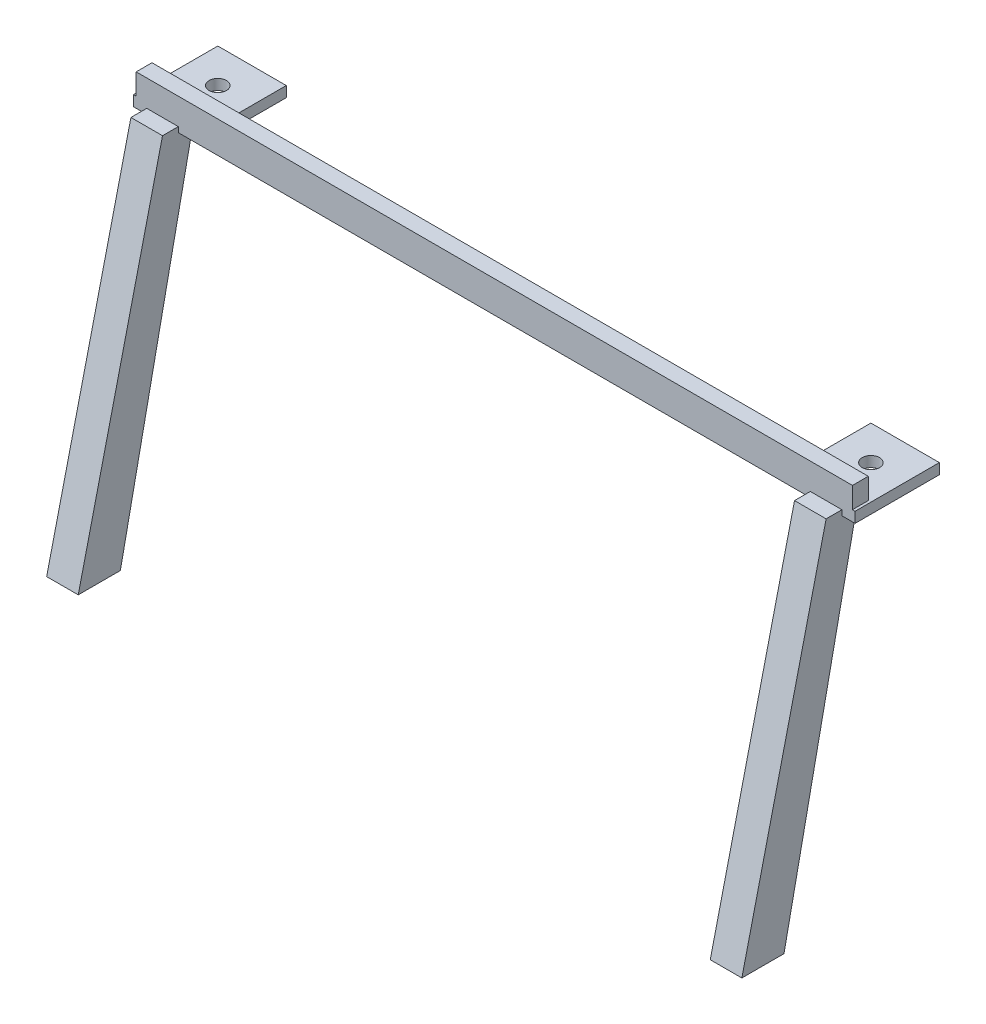
ISO-10303-21;
HEADER;
FILE_DESCRIPTION(('STEP AP214'),'2;1');
FILE_NAME('part.step','',(''),(''),'','','');
FILE_SCHEMA(('AUTOMOTIVE_DESIGN { 1 0 10303 214 1 1 1 1 }'));
ENDSEC;
DATA;
#1=APPLICATION_CONTEXT('core data for automotive mechanical design processes');
#2=APPLICATION_PROTOCOL_DEFINITION('international standard','automotive_design',2000,#1);
#3=PRODUCT_CONTEXT('',#1,'mechanical');
#4=PRODUCT('Part','Part','',(#3));
#5=PRODUCT_RELATED_PRODUCT_CATEGORY('part','',(#4));
#6=PRODUCT_DEFINITION_FORMATION('','',#4);
#7=PRODUCT_DEFINITION_CONTEXT('part definition',#1,'design');
#8=PRODUCT_DEFINITION('design','',#6,#7);
#9=PRODUCT_DEFINITION_SHAPE('','',#8);
#10=(LENGTH_UNIT() NAMED_UNIT(*) SI_UNIT(.MILLI.,.METRE.));
#11=(NAMED_UNIT(*) PLANE_ANGLE_UNIT() SI_UNIT($,.RADIAN.));
#12=(NAMED_UNIT(*) SI_UNIT($,.STERADIAN.) SOLID_ANGLE_UNIT());
#13=UNCERTAINTY_MEASURE_WITH_UNIT(LENGTH_MEASURE(1.E-05),#10,'distance_accuracy_value','');
#14=(GEOMETRIC_REPRESENTATION_CONTEXT(3) GLOBAL_UNCERTAINTY_ASSIGNED_CONTEXT((#13)) GLOBAL_UNIT_ASSIGNED_CONTEXT((#10,
#11,#12)) REPRESENTATION_CONTEXT('',''));
#15=CARTESIAN_POINT('',(0.,0.,0.));
#16=DIRECTION('',(0.,0.,1.));
#17=DIRECTION('',(1.,0.,0.));
#18=AXIS2_PLACEMENT_3D('',#15,#16,#17);
#19=CARTESIAN_POINT('',(0.,0.,0.));
#20=DIRECTION('',(0.,0.,1.));
#21=DIRECTION('',(1.,0.,0.));
#22=AXIS2_PLACEMENT_3D('',#19,#20,#21);
#23=PLANE('',#22);
#24=DIRECTION('',(0.,1.,0.));
#25=VECTOR('',#24,1.);
#26=CARTESIAN_POINT('',(55.5,0.,0.));
#27=LINE('',#26,#25);
#28=CARTESIAN_POINT('',(55.5,78.5,0.));
#29=VERTEX_POINT('',#28);
#30=CARTESIAN_POINT('',(55.5,80.5,0.));
#31=VERTEX_POINT('',#30);
#32=EDGE_CURVE('E304',#29,#31,#27,.T.);
#33=ORIENTED_EDGE('',*,*,#32,.F.);
#34=DIRECTION('',(1.,0.,0.));
#35=VECTOR('',#34,1.);
#36=CARTESIAN_POINT('',(-68.,78.5,0.));
#37=LINE('',#36,#35);
#38=CARTESIAN_POINT('',(-55.5,78.5,0.));
#39=VERTEX_POINT('',#38);
#40=EDGE_CURVE('E356',#39,#29,#37,.T.);
#41=ORIENTED_EDGE('',*,*,#40,.F.);
#42=DIRECTION('',(0.,-1.,0.));
#43=VECTOR('',#42,1.);
#44=CARTESIAN_POINT('',(-55.5,0.,0.));
#45=LINE('',#44,#43);
#46=CARTESIAN_POINT('',(-55.5,80.5,0.));
#47=VERTEX_POINT('',#46);
#48=EDGE_CURVE('E370',#47,#39,#45,.T.);
#49=ORIENTED_EDGE('',*,*,#48,.F.);
#50=DIRECTION('',(1.,0.,0.));
#51=VECTOR('',#50,1.);
#52=CARTESIAN_POINT('',(0.,80.5,0.));
#53=LINE('',#52,#51);
#54=CARTESIAN_POINT('',(-68.,80.5,0.));
#55=VERTEX_POINT('',#54);
#56=EDGE_CURVE('E367',#55,#47,#53,.T.);
#57=ORIENTED_EDGE('',*,*,#56,.F.);
#58=DIRECTION('',(0.,-1.,0.));
#59=VECTOR('',#58,1.);
#60=CARTESIAN_POINT('',(-68.,84.5,0.));
#61=LINE('',#60,#59);
#62=CARTESIAN_POINT('',(-68.,84.5,0.));
#63=VERTEX_POINT('',#62);
#64=EDGE_CURVE('E339',#63,#55,#61,.T.);
#65=ORIENTED_EDGE('',*,*,#64,.F.);
#66=DIRECTION('',(-1.,0.,0.));
#67=VECTOR('',#66,1.);
#68=CARTESIAN_POINT('',(68.,84.5,0.));
#69=LINE('',#68,#67);
#70=CARTESIAN_POINT('',(68.,84.5,0.));
#71=VERTEX_POINT('',#70);
#72=EDGE_CURVE('E344',#71,#63,#69,.T.);
#73=ORIENTED_EDGE('',*,*,#72,.F.);
#74=DIRECTION('',(0.,1.,0.));
#75=VECTOR('',#74,1.);
#76=CARTESIAN_POINT('',(68.,78.5,0.));
#77=LINE('',#76,#75);
#78=CARTESIAN_POINT('',(68.,80.5,0.));
#79=VERTEX_POINT('',#78);
#80=EDGE_CURVE('E359',#79,#71,#77,.T.);
#81=ORIENTED_EDGE('',*,*,#80,.F.);
#82=DIRECTION('',(1.,0.,0.));
#83=VECTOR('',#82,1.);
#84=CARTESIAN_POINT('',(0.,80.5,0.));
#85=LINE('',#84,#83);
#86=EDGE_CURVE('E302',#31,#79,#85,.T.);
#87=ORIENTED_EDGE('',*,*,#86,.F.);
#88=EDGE_LOOP('',(#33,#41,#49,#57,#65,#73,#81,#87));
#89=FACE_BOUND('',#88,.T.);
#90=ADVANCED_FACE('F39',(#89),#23,.F.);
#91=CARTESIAN_POINT('',(68.,78.5,3.));
#92=DIRECTION('',(-1.,0.,0.));
#93=DIRECTION('',(0.,0.,1.));
#94=AXIS2_PLACEMENT_3D('',#91,#92,#93);
#95=PLANE('',#94);
#96=DIRECTION('',(0.,0.,1.));
#97=VECTOR('',#96,1.);
#98=CARTESIAN_POINT('',(68.,80.5,3.));
#99=LINE('',#98,#97);
#100=CARTESIAN_POINT('',(68.,80.5,3.));
#101=VERTEX_POINT('',#100);
#102=EDGE_CURVE('E299',#79,#101,#99,.T.);
#103=ORIENTED_EDGE('',*,*,#102,.F.);
#104=ORIENTED_EDGE('',*,*,#80,.T.);
#105=DIRECTION('',(0.,0.,-1.));
#106=VECTOR('',#105,1.);
#107=CARTESIAN_POINT('',(68.,84.5,3.));
#108=LINE('',#107,#106);
#109=CARTESIAN_POINT('',(68.,84.5,3.));
#110=VERTEX_POINT('',#109);
#111=EDGE_CURVE('E364',#110,#71,#108,.T.);
#112=ORIENTED_EDGE('',*,*,#111,.F.);
#113=DIRECTION('',(0.,1.,0.));
#114=VECTOR('',#113,1.);
#115=CARTESIAN_POINT('',(68.,78.5,3.));
#116=LINE('',#115,#114);
#117=EDGE_CURVE('E348',#101,#110,#116,.T.);
#118=ORIENTED_EDGE('',*,*,#117,.F.);
#119=EDGE_LOOP('',(#103,#104,#112,#118));
#120=FACE_BOUND('',#119,.T.);
#121=ADVANCED_FACE('F420',(#120),#95,.F.);
#122=CARTESIAN_POINT('',(-68.,84.5,3.));
#123=DIRECTION('',(1.,0.,0.));
#124=DIRECTION('',(0.,0.,-1.));
#125=AXIS2_PLACEMENT_3D('',#122,#123,#124);
#126=PLANE('',#125);
#127=DIRECTION('',(0.,0.,-1.));
#128=VECTOR('',#127,1.);
#129=CARTESIAN_POINT('',(-68.,80.5,3.));
#130=LINE('',#129,#128);
#131=CARTESIAN_POINT('',(-68.,80.5,3.));
#132=VERTEX_POINT('',#131);
#133=EDGE_CURVE('E336',#132,#55,#130,.T.);
#134=ORIENTED_EDGE('',*,*,#133,.F.);
#135=DIRECTION('',(0.,-1.,0.));
#136=VECTOR('',#135,1.);
#137=CARTESIAN_POINT('',(-68.,84.5,3.));
#138=LINE('',#137,#136);
#139=CARTESIAN_POINT('',(-68.,84.5,3.));
#140=VERTEX_POINT('',#139);
#141=EDGE_CURVE('E340',#140,#132,#138,.T.);
#142=ORIENTED_EDGE('',*,*,#141,.F.);
#143=DIRECTION('',(0.,0.,-1.));
#144=VECTOR('',#143,1.);
#145=CARTESIAN_POINT('',(-68.,84.5,3.));
#146=LINE('',#145,#144);
#147=EDGE_CURVE('E353',#140,#63,#146,.T.);
#148=ORIENTED_EDGE('',*,*,#147,.T.);
#149=ORIENTED_EDGE('',*,*,#64,.T.);
#150=EDGE_LOOP('',(#134,#142,#148,#149));
#151=FACE_BOUND('',#150,.T.);
#152=ADVANCED_FACE('F41',(#151),#126,.F.);
#153=CARTESIAN_POINT('',(-68.,78.5,3.));
#154=DIRECTION('',(0.,1.,0.));
#155=DIRECTION('',(0.,0.,1.));
#156=AXIS2_PLACEMENT_3D('',#153,#154,#155);
#157=PLANE('',#156);
#158=CARTESIAN_POINT('',(62.,78.5,-6.5));
#159=DIRECTION('',(0.,1.,0.));
#160=DIRECTION('',(0.,0.,1.));
#161=AXIS2_PLACEMENT_3D('',#158,#159,#160);
#162=CIRCLE('',#161,1.65);
#163=CARTESIAN_POINT('',(62.,78.5,-4.85));
#164=VERTEX_POINT('',#163);
#165=EDGE_CURVE('E272',#164,#164,#162,.T.);
#166=ORIENTED_EDGE('',*,*,#165,.T.);
#167=EDGE_LOOP('',(#166));
#168=FACE_BOUND('',#167,.T.);
#169=DIRECTION('',(1.,0.,0.));
#170=VECTOR('',#169,1.);
#171=CARTESIAN_POINT('',(-68.,78.5,3.));
#172=LINE('',#171,#170);
#173=CARTESIAN_POINT('',(66.,78.5,3.));
#174=VERTEX_POINT('',#173);
#175=CARTESIAN_POINT('',(68.5,78.5,3.));
#176=VERTEX_POINT('',#175);
#177=EDGE_CURVE('E343',#174,#176,#172,.T.);
#178=ORIENTED_EDGE('',*,*,#177,.F.);
#179=DIRECTION('',(0.,0.,-1.));
#180=VECTOR('',#179,1.);
#181=CARTESIAN_POINT('',(66.,78.5,3.));
#182=LINE('',#181,#180);
#183=CARTESIAN_POINT('',(66.,78.5,0.207407407407406));
#184=VERTEX_POINT('',#183);
#185=EDGE_CURVE('E237',#174,#184,#182,.T.);
#186=ORIENTED_EDGE('',*,*,#185,.T.);
#187=DIRECTION('',(1.,0.,0.));
#188=VECTOR('',#187,1.);
#189=CARTESIAN_POINT('',(-68.,78.5,0.207407407407405));
#190=LINE('',#189,#188);
#191=CARTESIAN_POINT('',(60.,78.5,0.207407407407406));
#192=VERTEX_POINT('',#191);
#193=EDGE_CURVE('E11',#192,#184,#190,.T.);
#194=ORIENTED_EDGE('',*,*,#193,.F.);
#195=DIRECTION('',(0.,0.,-1.));
#196=VECTOR('',#195,1.);
#197=CARTESIAN_POINT('',(60.,78.5,3.));
#198=LINE('',#197,#196);
#199=CARTESIAN_POINT('',(60.,78.5,3.));
#200=VERTEX_POINT('',#199);
#201=EDGE_CURVE('E213',#200,#192,#198,.T.);
#202=ORIENTED_EDGE('',*,*,#201,.F.);
#203=CARTESIAN_POINT('',(-60.,78.5,3.));
#204=VERTEX_POINT('',#203);
#205=EDGE_CURVE('E349',#204,#200,#172,.T.);
#206=ORIENTED_EDGE('',*,*,#205,.F.);
#207=DIRECTION('',(0.,0.,-1.));
#208=VECTOR('',#207,1.);
#209=CARTESIAN_POINT('',(-60.,78.5,3.));
#210=LINE('',#209,#208);
#211=CARTESIAN_POINT('',(-60.,78.5,0.207407407407406));
#212=VERTEX_POINT('',#211);
#213=EDGE_CURVE('E268',#204,#212,#210,.T.);
#214=ORIENTED_EDGE('',*,*,#213,.T.);
#215=DIRECTION('',(1.,0.,0.));
#216=VECTOR('',#215,1.);
#217=CARTESIAN_POINT('',(-68.,78.5,0.207407407407405));
#218=LINE('',#217,#216);
#219=CARTESIAN_POINT('',(-66.,78.5,0.207407407407406));
#220=VERTEX_POINT('',#219);
#221=EDGE_CURVE('E385',#220,#212,#218,.T.);
#222=ORIENTED_EDGE('',*,*,#221,.F.);
#223=DIRECTION('',(0.,0.,-1.));
#224=VECTOR('',#223,1.);
#225=CARTESIAN_POINT('',(-66.,78.5,3.));
#226=LINE('',#225,#224);
#227=CARTESIAN_POINT('',(-66.,78.5,3.));
#228=VERTEX_POINT('',#227);
#229=EDGE_CURVE('E266',#228,#220,#226,.T.);
#230=ORIENTED_EDGE('',*,*,#229,.F.);
#231=CARTESIAN_POINT('',(-68.5,78.5,3.));
#232=VERTEX_POINT('',#231);
#233=EDGE_CURVE('E345',#232,#228,#172,.T.);
#234=ORIENTED_EDGE('',*,*,#233,.F.);
#235=DIRECTION('',(0.,0.,-1.));
#236=VECTOR('',#235,1.);
#237=CARTESIAN_POINT('',(-68.5,78.5,3.));
#238=LINE('',#237,#236);
#239=CARTESIAN_POINT('',(-68.5,78.5,-13.));
#240=VERTEX_POINT('',#239);
#241=EDGE_CURVE('E333',#232,#240,#238,.T.);
#242=ORIENTED_EDGE('',*,*,#241,.T.);
#243=DIRECTION('',(1.,0.,0.));
#244=VECTOR('',#243,1.);
#245=CARTESIAN_POINT('',(-68.5,78.5,-13.));
#246=LINE('',#245,#244);
#247=CARTESIAN_POINT('',(-55.5,78.5,-13.));
#248=VERTEX_POINT('',#247);
#249=EDGE_CURVE('E320',#240,#248,#246,.T.);
#250=ORIENTED_EDGE('',*,*,#249,.T.);
#251=DIRECTION('',(0.,0.,-1.));
#252=VECTOR('',#251,1.);
#253=CARTESIAN_POINT('',(-55.5,78.5,3.));
#254=LINE('',#253,#252);
#255=EDGE_CURVE('E331',#39,#248,#254,.T.);
#256=ORIENTED_EDGE('',*,*,#255,.F.);
#257=ORIENTED_EDGE('',*,*,#40,.T.);
#258=DIRECTION('',(0.,0.,-1.));
#259=VECTOR('',#258,1.);
#260=CARTESIAN_POINT('',(55.5,78.5,3.));
#261=LINE('',#260,#259);
#262=CARTESIAN_POINT('',(55.5,78.5,-13.));
#263=VERTEX_POINT('',#262);
#264=EDGE_CURVE('E297',#29,#263,#261,.T.);
#265=ORIENTED_EDGE('',*,*,#264,.T.);
#266=DIRECTION('',(1.,0.,0.));
#267=VECTOR('',#266,1.);
#268=CARTESIAN_POINT('',(55.5,78.5,-13.));
#269=LINE('',#268,#267);
#270=CARTESIAN_POINT('',(68.5,78.5,-13.));
#271=VERTEX_POINT('',#270);
#272=EDGE_CURVE('E284',#263,#271,#269,.T.);
#273=ORIENTED_EDGE('',*,*,#272,.T.);
#274=DIRECTION('',(0.,0.,-1.));
#275=VECTOR('',#274,1.);
#276=CARTESIAN_POINT('',(68.5,78.5,3.));
#277=LINE('',#276,#275);
#278=EDGE_CURVE('E294',#176,#271,#277,.T.);
#279=ORIENTED_EDGE('',*,*,#278,.F.);
#280=EDGE_LOOP('',(#178,#186,#194,#202,#206,#214,#222,#230,#234,#242,#250,#256,#257,#265,#273,#279));
#281=FACE_BOUND('',#280,.T.);
#282=CARTESIAN_POINT('',(-62.,78.5,-6.5));
#283=DIRECTION('',(0.,1.,0.));
#284=DIRECTION('',(0.,0.,1.));
#285=AXIS2_PLACEMENT_3D('',#282,#283,#284);
#286=CIRCLE('',#285,1.65);
#287=CARTESIAN_POINT('',(-62.,78.5,-4.85));
#288=VERTEX_POINT('',#287);
#289=EDGE_CURVE('E307',#288,#288,#286,.T.);
#290=ORIENTED_EDGE('',*,*,#289,.T.);
#291=EDGE_LOOP('',(#290));
#292=FACE_BOUND('',#291,.T.);
#293=ADVANCED_FACE('F402',(#168,#281,#292),#157,.F.);
#294=CARTESIAN_POINT('',(68.,84.5,3.));
#295=DIRECTION('',(0.,-1.,0.));
#296=DIRECTION('',(0.,0.,-1.));
#297=AXIS2_PLACEMENT_3D('',#294,#295,#296);
#298=PLANE('',#297);
#299=ORIENTED_EDGE('',*,*,#72,.T.);
#300=ORIENTED_EDGE('',*,*,#147,.F.);
#301=DIRECTION('',(-1.,0.,0.));
#302=VECTOR('',#301,1.);
#303=CARTESIAN_POINT('',(68.,84.5,3.));
#304=LINE('',#303,#302);
#305=EDGE_CURVE('E351',#110,#140,#304,.T.);
#306=ORIENTED_EDGE('',*,*,#305,.F.);
#307=ORIENTED_EDGE('',*,*,#111,.T.);
#308=EDGE_LOOP('',(#299,#300,#306,#307));
#309=FACE_BOUND('',#308,.T.);
#310=ADVANCED_FACE('F432',(#309),#298,.F.);
#311=CARTESIAN_POINT('',(0.,0.,3.));
#312=DIRECTION('',(0.,0.,1.));
#313=DIRECTION('',(1.,0.,0.));
#314=AXIS2_PLACEMENT_3D('',#311,#312,#313);
#315=PLANE('',#314);
#316=DIRECTION('',(0.,1.,0.));
#317=VECTOR('',#316,1.);
#318=CARTESIAN_POINT('',(66.,0.,3.));
#319=LINE('',#318,#317);
#320=CARTESIAN_POINT('',(66.,79.5,3.));
#321=VERTEX_POINT('',#320);
#322=EDGE_CURVE('E47',#174,#321,#319,.T.);
#323=ORIENTED_EDGE('',*,*,#322,.F.);
#324=ORIENTED_EDGE('',*,*,#177,.T.);
#325=DIRECTION('',(0.,1.,0.));
#326=VECTOR('',#325,1.);
#327=CARTESIAN_POINT('',(68.5,78.5,3.));
#328=LINE('',#327,#326);
#329=CARTESIAN_POINT('',(68.5,80.5,3.));
#330=VERTEX_POINT('',#329);
#331=EDGE_CURVE('E276',#176,#330,#328,.T.);
#332=ORIENTED_EDGE('',*,*,#331,.T.);
#333=DIRECTION('',(-1.,0.,0.));
#334=VECTOR('',#333,1.);
#335=CARTESIAN_POINT('',(68.5,80.5,3.));
#336=LINE('',#335,#334);
#337=EDGE_CURVE('E278',#330,#101,#336,.T.);
#338=ORIENTED_EDGE('',*,*,#337,.T.);
#339=ORIENTED_EDGE('',*,*,#117,.T.);
#340=ORIENTED_EDGE('',*,*,#305,.T.);
#341=ORIENTED_EDGE('',*,*,#141,.T.);
#342=DIRECTION('',(-1.,0.,0.));
#343=VECTOR('',#342,1.);
#344=CARTESIAN_POINT('',(-55.5,80.5,3.));
#345=LINE('',#344,#343);
#346=CARTESIAN_POINT('',(-68.5,80.5,3.));
#347=VERTEX_POINT('',#346);
#348=EDGE_CURVE('E314',#132,#347,#345,.T.);
#349=ORIENTED_EDGE('',*,*,#348,.T.);
#350=DIRECTION('',(0.,-1.,0.));
#351=VECTOR('',#350,1.);
#352=CARTESIAN_POINT('',(-68.5,80.5,3.));
#353=LINE('',#352,#351);
#354=EDGE_CURVE('E311',#347,#232,#353,.T.);
#355=ORIENTED_EDGE('',*,*,#354,.T.);
#356=ORIENTED_EDGE('',*,*,#233,.T.);
#357=DIRECTION('',(0.,1.,0.));
#358=VECTOR('',#357,1.);
#359=CARTESIAN_POINT('',(-66.,0.,3.));
#360=LINE('',#359,#358);
#361=CARTESIAN_POINT('',(-66.,79.5,3.));
#362=VERTEX_POINT('',#361);
#363=EDGE_CURVE('E373',#228,#362,#360,.T.);
#364=ORIENTED_EDGE('',*,*,#363,.T.);
#365=DIRECTION('',(1.,0.,0.));
#366=VECTOR('',#365,1.);
#367=CARTESIAN_POINT('',(0.,79.5,3.));
#368=LINE('',#367,#366);
#369=CARTESIAN_POINT('',(-60.,79.5,3.));
#370=VERTEX_POINT('',#369);
#371=EDGE_CURVE('E380',#362,#370,#368,.T.);
#372=ORIENTED_EDGE('',*,*,#371,.T.);
#373=DIRECTION('',(0.,1.,0.));
#374=VECTOR('',#373,1.);
#375=CARTESIAN_POINT('',(-60.,0.,3.));
#376=LINE('',#375,#374);
#377=EDGE_CURVE('E383',#204,#370,#376,.T.);
#378=ORIENTED_EDGE('',*,*,#377,.F.);
#379=ORIENTED_EDGE('',*,*,#205,.T.);
#380=DIRECTION('',(0.,1.,0.));
#381=VECTOR('',#380,1.);
#382=CARTESIAN_POINT('',(60.,0.,3.));
#383=LINE('',#382,#381);
#384=CARTESIAN_POINT('',(60.,79.5,3.));
#385=VERTEX_POINT('',#384);
#386=EDGE_CURVE('E387',#200,#385,#383,.T.);
#387=ORIENTED_EDGE('',*,*,#386,.T.);
#388=DIRECTION('',(1.,0.,0.));
#389=VECTOR('',#388,1.);
#390=CARTESIAN_POINT('',(0.,79.5,3.));
#391=LINE('',#390,#389);
#392=EDGE_CURVE('E390',#385,#321,#391,.T.);
#393=ORIENTED_EDGE('',*,*,#392,.T.);
#394=EDGE_LOOP('',(#323,#324,#332,#338,#339,#340,#341,#349,#355,#356,#364,#372,#378,#379,#387,#393));
#395=FACE_BOUND('',#394,.T.);
#396=ADVANCED_FACE('F392',(#395),#315,.T.);
#397=CARTESIAN_POINT('',(-55.5,78.5,3.));
#398=DIRECTION('',(-1.,0.,0.));
#399=DIRECTION('',(0.,0.,1.));
#400=AXIS2_PLACEMENT_3D('',#397,#398,#399);
#401=PLANE('',#400);
#402=DIRECTION('',(0.,0.,-1.));
#403=VECTOR('',#402,1.);
#404=CARTESIAN_POINT('',(-55.5,80.5,3.));
#405=LINE('',#404,#403);
#406=CARTESIAN_POINT('',(-55.5,80.5,-13.));
#407=VERTEX_POINT('',#406);
#408=EDGE_CURVE('E329',#47,#407,#405,.T.);
#409=ORIENTED_EDGE('',*,*,#408,.F.);
#410=ORIENTED_EDGE('',*,*,#48,.T.);
#411=ORIENTED_EDGE('',*,*,#255,.T.);
#412=DIRECTION('',(0.,1.,0.));
#413=VECTOR('',#412,1.);
#414=CARTESIAN_POINT('',(-55.5,78.5,-13.));
#415=LINE('',#414,#413);
#416=EDGE_CURVE('E323',#248,#407,#415,.T.);
#417=ORIENTED_EDGE('',*,*,#416,.T.);
#418=EDGE_LOOP('',(#409,#410,#411,#417));
#419=FACE_BOUND('',#418,.T.);
#420=ADVANCED_FACE('F485',(#419),#401,.F.);
#421=CARTESIAN_POINT('',(-55.5,80.5,3.));
#422=DIRECTION('',(0.,-1.,0.));
#423=DIRECTION('',(0.,0.,-1.));
#424=AXIS2_PLACEMENT_3D('',#421,#422,#423);
#425=PLANE('',#424);
#426=CARTESIAN_POINT('',(-62.,80.5,-6.5));
#427=DIRECTION('',(0.,-1.,0.));
#428=DIRECTION('',(0.,0.,-1.));
#429=AXIS2_PLACEMENT_3D('',#426,#427,#428);
#430=CIRCLE('',#429,1.65);
#431=CARTESIAN_POINT('',(-62.,80.5,-8.15));
#432=VERTEX_POINT('',#431);
#433=EDGE_CURVE('E306',#432,#432,#430,.T.);
#434=ORIENTED_EDGE('',*,*,#433,.T.);
#435=EDGE_LOOP('',(#434));
#436=FACE_BOUND('',#435,.T.);
#437=ORIENTED_EDGE('',*,*,#348,.F.);
#438=ORIENTED_EDGE('',*,*,#133,.T.);
#439=ORIENTED_EDGE('',*,*,#56,.T.);
#440=ORIENTED_EDGE('',*,*,#408,.T.);
#441=DIRECTION('',(-1.,0.,0.));
#442=VECTOR('',#441,1.);
#443=CARTESIAN_POINT('',(-55.5,80.5,-13.));
#444=LINE('',#443,#442);
#445=CARTESIAN_POINT('',(-68.5,80.5,-13.));
#446=VERTEX_POINT('',#445);
#447=EDGE_CURVE('E315',#407,#446,#444,.T.);
#448=ORIENTED_EDGE('',*,*,#447,.T.);
#449=DIRECTION('',(0.,0.,-1.));
#450=VECTOR('',#449,1.);
#451=CARTESIAN_POINT('',(-68.5,80.5,3.));
#452=LINE('',#451,#450);
#453=EDGE_CURVE('E317',#347,#446,#452,.T.);
#454=ORIENTED_EDGE('',*,*,#453,.F.);
#455=EDGE_LOOP('',(#437,#438,#439,#440,#448,#454));
#456=FACE_BOUND('',#455,.T.);
#457=ADVANCED_FACE('F482',(#436,#456),#425,.F.);
#458=CARTESIAN_POINT('',(-68.5,80.5,3.));
#459=DIRECTION('',(1.,0.,0.));
#460=DIRECTION('',(0.,0.,-1.));
#461=AXIS2_PLACEMENT_3D('',#458,#459,#460);
#462=PLANE('',#461);
#463=DIRECTION('',(0.,-1.,0.));
#464=VECTOR('',#463,1.);
#465=CARTESIAN_POINT('',(-68.5,80.5,-13.));
#466=LINE('',#465,#464);
#467=EDGE_CURVE('E310',#446,#240,#466,.T.);
#468=ORIENTED_EDGE('',*,*,#467,.T.);
#469=ORIENTED_EDGE('',*,*,#241,.F.);
#470=ORIENTED_EDGE('',*,*,#354,.F.);
#471=ORIENTED_EDGE('',*,*,#453,.T.);
#472=EDGE_LOOP('',(#468,#469,#470,#471));
#473=FACE_BOUND('',#472,.T.);
#474=ADVANCED_FACE('F480',(#473),#462,.F.);
#475=CARTESIAN_POINT('',(0.,0.,-13.));
#476=DIRECTION('',(0.,0.,1.));
#477=DIRECTION('',(1.,0.,0.));
#478=AXIS2_PLACEMENT_3D('',#475,#476,#477);
#479=PLANE('',#478);
#480=ORIENTED_EDGE('',*,*,#467,.F.);
#481=ORIENTED_EDGE('',*,*,#447,.F.);
#482=ORIENTED_EDGE('',*,*,#416,.F.);
#483=ORIENTED_EDGE('',*,*,#249,.F.);
#484=EDGE_LOOP('',(#480,#481,#482,#483));
#485=FACE_BOUND('',#484,.T.);
#486=ADVANCED_FACE('F476',(#485),#479,.F.);
#487=CARTESIAN_POINT('',(-62.,-100.,-6.5));
#488=DIRECTION('',(0.,1.,0.));
#489=DIRECTION('',(0.,0.,1.));
#490=AXIS2_PLACEMENT_3D('',#487,#488,#489);
#491=CYLINDRICAL_SURFACE('',#490,1.65);
#492=ORIENTED_EDGE('',*,*,#433,.F.);
#493=EDGE_LOOP('',(#492));
#494=FACE_BOUND('',#493,.T.);
#495=ORIENTED_EDGE('',*,*,#289,.F.);
#496=EDGE_LOOP('',(#495));
#497=FACE_BOUND('',#496,.T.);
#498=ADVANCED_FACE('F472',(#494,#497),#491,.F.);
#499=CARTESIAN_POINT('',(55.5,80.5,3.));
#500=DIRECTION('',(1.,0.,0.));
#501=DIRECTION('',(0.,0.,-1.));
#502=AXIS2_PLACEMENT_3D('',#499,#500,#501);
#503=PLANE('',#502);
#504=ORIENTED_EDGE('',*,*,#264,.F.);
#505=ORIENTED_EDGE('',*,*,#32,.T.);
#506=DIRECTION('',(0.,0.,-1.));
#507=VECTOR('',#506,1.);
#508=CARTESIAN_POINT('',(55.5,80.5,3.));
#509=LINE('',#508,#507);
#510=CARTESIAN_POINT('',(55.5,80.5,-13.));
#511=VERTEX_POINT('',#510);
#512=EDGE_CURVE('E281',#31,#511,#509,.T.);
#513=ORIENTED_EDGE('',*,*,#512,.T.);
#514=DIRECTION('',(0.,-1.,0.));
#515=VECTOR('',#514,1.);
#516=CARTESIAN_POINT('',(55.5,80.5,-13.));
#517=LINE('',#516,#515);
#518=EDGE_CURVE('E275',#511,#263,#517,.T.);
#519=ORIENTED_EDGE('',*,*,#518,.T.);
#520=EDGE_LOOP('',(#504,#505,#513,#519));
#521=FACE_BOUND('',#520,.T.);
#522=ADVANCED_FACE('F465',(#521),#503,.F.);
#523=CARTESIAN_POINT('',(68.5,80.5,3.));
#524=DIRECTION('',(0.,-1.,0.));
#525=DIRECTION('',(0.,0.,-1.));
#526=AXIS2_PLACEMENT_3D('',#523,#524,#525);
#527=PLANE('',#526);
#528=CARTESIAN_POINT('',(62.,80.5,-6.5));
#529=DIRECTION('',(0.,-1.,0.));
#530=DIRECTION('',(0.,0.,-1.));
#531=AXIS2_PLACEMENT_3D('',#528,#529,#530);
#532=CIRCLE('',#531,1.65);
#533=CARTESIAN_POINT('',(62.,80.5,-8.15));
#534=VERTEX_POINT('',#533);
#535=EDGE_CURVE('E271',#534,#534,#532,.T.);
#536=ORIENTED_EDGE('',*,*,#535,.T.);
#537=EDGE_LOOP('',(#536));
#538=FACE_BOUND('',#537,.T.);
#539=ORIENTED_EDGE('',*,*,#512,.F.);
#540=ORIENTED_EDGE('',*,*,#86,.T.);
#541=ORIENTED_EDGE('',*,*,#102,.T.);
#542=ORIENTED_EDGE('',*,*,#337,.F.);
#543=DIRECTION('',(0.,0.,-1.));
#544=VECTOR('',#543,1.);
#545=CARTESIAN_POINT('',(68.5,80.5,3.));
#546=LINE('',#545,#544);
#547=CARTESIAN_POINT('',(68.5,80.5,-13.));
#548=VERTEX_POINT('',#547);
#549=EDGE_CURVE('E291',#330,#548,#546,.T.);
#550=ORIENTED_EDGE('',*,*,#549,.T.);
#551=DIRECTION('',(-1.,0.,0.));
#552=VECTOR('',#551,1.);
#553=CARTESIAN_POINT('',(68.5,80.5,-13.));
#554=LINE('',#553,#552);
#555=EDGE_CURVE('E279',#548,#511,#554,.T.);
#556=ORIENTED_EDGE('',*,*,#555,.T.);
#557=EDGE_LOOP('',(#539,#540,#541,#542,#550,#556));
#558=FACE_BOUND('',#557,.T.);
#559=ADVANCED_FACE('F462',(#538,#558),#527,.F.);
#560=CARTESIAN_POINT('',(68.5,78.5,3.));
#561=DIRECTION('',(-1.,0.,0.));
#562=DIRECTION('',(0.,0.,1.));
#563=AXIS2_PLACEMENT_3D('',#560,#561,#562);
#564=PLANE('',#563);
#565=DIRECTION('',(0.,1.,0.));
#566=VECTOR('',#565,1.);
#567=CARTESIAN_POINT('',(68.5,78.5,-13.));
#568=LINE('',#567,#566);
#569=EDGE_CURVE('E286',#271,#548,#568,.T.);
#570=ORIENTED_EDGE('',*,*,#569,.T.);
#571=ORIENTED_EDGE('',*,*,#549,.F.);
#572=ORIENTED_EDGE('',*,*,#331,.F.);
#573=ORIENTED_EDGE('',*,*,#278,.T.);
#574=EDGE_LOOP('',(#570,#571,#572,#573));
#575=FACE_BOUND('',#574,.T.);
#576=ADVANCED_FACE('F456',(#575),#564,.F.);
#577=CARTESIAN_POINT('',(0.,0.,-13.));
#578=DIRECTION('',(0.,0.,1.));
#579=DIRECTION('',(1.,0.,0.));
#580=AXIS2_PLACEMENT_3D('',#577,#578,#579);
#581=PLANE('',#580);
#582=ORIENTED_EDGE('',*,*,#518,.F.);
#583=ORIENTED_EDGE('',*,*,#555,.F.);
#584=ORIENTED_EDGE('',*,*,#569,.F.);
#585=ORIENTED_EDGE('',*,*,#272,.F.);
#586=EDGE_LOOP('',(#582,#583,#584,#585));
#587=FACE_BOUND('',#586,.T.);
#588=ADVANCED_FACE('F446',(#587),#581,.F.);
#589=CARTESIAN_POINT('',(62.,-100.,-6.5));
#590=DIRECTION('',(0.,1.,0.));
#591=DIRECTION('',(0.,0.,1.));
#592=AXIS2_PLACEMENT_3D('',#589,#590,#591);
#593=CYLINDRICAL_SURFACE('',#592,1.65);
#594=ORIENTED_EDGE('',*,*,#535,.F.);
#595=EDGE_LOOP('',(#594));
#596=FACE_BOUND('',#595,.T.);
#597=ORIENTED_EDGE('',*,*,#165,.F.);
#598=EDGE_LOOP('',(#597));
#599=FACE_BOUND('',#598,.T.);
#600=ADVANCED_FACE('F443',(#596,#599),#593,.F.);
#601=CARTESIAN_POINT('',(-60.,12.,14.));
#602=DIRECTION('',(0.,0.203085256585688,0.979161058538137));
#603=DIRECTION('',(0.,-0.979161058538137,0.203085256585688));
#604=AXIS2_PLACEMENT_3D('',#601,#602,#603);
#605=PLANE('',#604);
#606=DIRECTION('',(0.,0.979161058538137,-0.203085256585688));
#607=VECTOR('',#606,1.);
#608=CARTESIAN_POINT('',(-66.,12.,14.));
#609=LINE('',#608,#607);
#610=CARTESIAN_POINT('',(-66.,12.,14.));
#611=VERTEX_POINT('',#610);
#612=EDGE_CURVE('E240',#611,#220,#609,.T.);
#613=ORIENTED_EDGE('',*,*,#612,.T.);
#614=ORIENTED_EDGE('',*,*,#221,.T.);
#615=DIRECTION('',(0.,0.979161058538137,-0.203085256585688));
#616=VECTOR('',#615,1.);
#617=CARTESIAN_POINT('',(-60.,12.,14.));
#618=LINE('',#617,#616);
#619=CARTESIAN_POINT('',(-60.,12.,14.));
#620=VERTEX_POINT('',#619);
#621=EDGE_CURVE('E241',#620,#212,#618,.T.);
#622=ORIENTED_EDGE('',*,*,#621,.F.);
#623=DIRECTION('',(-1.,0.,0.));
#624=VECTOR('',#623,1.);
#625=CARTESIAN_POINT('',(-60.,12.,14.));
#626=LINE('',#625,#624);
#627=EDGE_CURVE('E251',#620,#611,#626,.T.);
#628=ORIENTED_EDGE('',*,*,#627,.T.);
#629=EDGE_LOOP('',(#613,#614,#622,#628));
#630=FACE_BOUND('',#629,.T.);
#631=ADVANCED_FACE('F445',(#630),#605,.F.);
#632=CARTESIAN_POINT('',(-60.,0.,0.));
#633=DIRECTION('',(1.,0.,0.));
#634=DIRECTION('',(0.,0.,-1.));
#635=AXIS2_PLACEMENT_3D('',#632,#633,#634);
#636=PLANE('',#635);
#637=ORIENTED_EDGE('',*,*,#213,.F.);
#638=ORIENTED_EDGE('',*,*,#377,.T.);
#639=DIRECTION('',(0.,0.,1.));
#640=VECTOR('',#639,1.);
#641=CARTESIAN_POINT('',(-60.,79.5,0.));
#642=LINE('',#641,#640);
#643=CARTESIAN_POINT('',(-60.,79.5,6.));
#644=VERTEX_POINT('',#643);
#645=EDGE_CURVE('E244',#370,#644,#642,.T.);
#646=ORIENTED_EDGE('',*,*,#645,.T.);
#647=DIRECTION('',(0.,-0.973037733746812,0.230645981332578));
#648=VECTOR('',#647,1.);
#649=CARTESIAN_POINT('',(-60.,79.5,6.));
#650=LINE('',#649,#648);
#651=CARTESIAN_POINT('',(-60.,12.,22.));
#652=VERTEX_POINT('',#651);
#653=EDGE_CURVE('E247',#644,#652,#650,.T.);
#654=ORIENTED_EDGE('',*,*,#653,.T.);
#655=DIRECTION('',(0.,0.,-1.));
#656=VECTOR('',#655,1.);
#657=CARTESIAN_POINT('',(-60.,12.,22.));
#658=LINE('',#657,#656);
#659=EDGE_CURVE('E249',#652,#620,#658,.T.);
#660=ORIENTED_EDGE('',*,*,#659,.T.);
#661=ORIENTED_EDGE('',*,*,#621,.T.);
#662=EDGE_LOOP('',(#637,#638,#646,#654,#660,#661));
#663=FACE_BOUND('',#662,.T.);
#664=ADVANCED_FACE('F453',(#663),#636,.T.);
#665=CARTESIAN_POINT('',(-66.,0.,0.));
#666=DIRECTION('',(1.,0.,0.));
#667=DIRECTION('',(0.,0.,-1.));
#668=AXIS2_PLACEMENT_3D('',#665,#666,#667);
#669=PLANE('',#668);
#670=ORIENTED_EDGE('',*,*,#363,.F.);
#671=ORIENTED_EDGE('',*,*,#229,.T.);
#672=ORIENTED_EDGE('',*,*,#612,.F.);
#673=DIRECTION('',(0.,0.,-1.));
#674=VECTOR('',#673,1.);
#675=CARTESIAN_POINT('',(-66.,12.,22.));
#676=LINE('',#675,#674);
#677=CARTESIAN_POINT('',(-66.,12.,22.));
#678=VERTEX_POINT('',#677);
#679=EDGE_CURVE('E245',#678,#611,#676,.T.);
#680=ORIENTED_EDGE('',*,*,#679,.F.);
#681=DIRECTION('',(0.,-0.973037733746812,0.230645981332578));
#682=VECTOR('',#681,1.);
#683=CARTESIAN_POINT('',(-66.,79.5,6.));
#684=LINE('',#683,#682);
#685=CARTESIAN_POINT('',(-66.,79.5,6.));
#686=VERTEX_POINT('',#685);
#687=EDGE_CURVE('E255',#686,#678,#684,.T.);
#688=ORIENTED_EDGE('',*,*,#687,.F.);
#689=DIRECTION('',(0.,0.,1.));
#690=VECTOR('',#689,1.);
#691=CARTESIAN_POINT('',(-66.,79.5,0.));
#692=LINE('',#691,#690);
#693=EDGE_CURVE('E62',#362,#686,#692,.T.);
#694=ORIENTED_EDGE('',*,*,#693,.F.);
#695=EDGE_LOOP('',(#670,#671,#672,#680,#688,#694));
#696=FACE_BOUND('',#695,.T.);
#697=ADVANCED_FACE('F525',(#696),#669,.F.);
#698=CARTESIAN_POINT('',(-60.,79.5,0.));
#699=DIRECTION('',(0.,-1.,0.));
#700=DIRECTION('',(0.,0.,-1.));
#701=AXIS2_PLACEMENT_3D('',#698,#699,#700);
#702=PLANE('',#701);
#703=ORIENTED_EDGE('',*,*,#371,.F.);
#704=ORIENTED_EDGE('',*,*,#693,.T.);
#705=DIRECTION('',(-1.,0.,0.));
#706=VECTOR('',#705,1.);
#707=CARTESIAN_POINT('',(-60.,79.5,6.));
#708=LINE('',#707,#706);
#709=EDGE_CURVE('E263',#644,#686,#708,.T.);
#710=ORIENTED_EDGE('',*,*,#709,.F.);
#711=ORIENTED_EDGE('',*,*,#645,.F.);
#712=EDGE_LOOP('',(#703,#704,#710,#711));
#713=FACE_BOUND('',#712,.T.);
#714=ADVANCED_FACE('F541',(#713),#702,.F.);
#715=CARTESIAN_POINT('',(-60.,79.5,6.));
#716=DIRECTION('',(0.,-0.230645981332578,-0.973037733746812));
#717=DIRECTION('',(0.,0.973037733746812,-0.230645981332578));
#718=AXIS2_PLACEMENT_3D('',#715,#716,#717);
#719=PLANE('',#718);
#720=ORIENTED_EDGE('',*,*,#687,.T.);
#721=DIRECTION('',(-1.,0.,0.));
#722=VECTOR('',#721,1.);
#723=CARTESIAN_POINT('',(-60.,12.,22.));
#724=LINE('',#723,#722);
#725=EDGE_CURVE('E260',#652,#678,#724,.T.);
#726=ORIENTED_EDGE('',*,*,#725,.F.);
#727=ORIENTED_EDGE('',*,*,#653,.F.);
#728=ORIENTED_EDGE('',*,*,#709,.T.);
#729=EDGE_LOOP('',(#720,#726,#727,#728));
#730=FACE_BOUND('',#729,.T.);
#731=ADVANCED_FACE('F538',(#730),#719,.F.);
#732=CARTESIAN_POINT('',(-60.,12.,22.));
#733=DIRECTION('',(0.,1.,0.));
#734=DIRECTION('',(0.,0.,1.));
#735=AXIS2_PLACEMENT_3D('',#732,#733,#734);
#736=PLANE('',#735);
#737=ORIENTED_EDGE('',*,*,#679,.T.);
#738=ORIENTED_EDGE('',*,*,#627,.F.);
#739=ORIENTED_EDGE('',*,*,#659,.F.);
#740=ORIENTED_EDGE('',*,*,#725,.T.);
#741=EDGE_LOOP('',(#737,#738,#739,#740));
#742=FACE_BOUND('',#741,.T.);
#743=ADVANCED_FACE('F536',(#742),#736,.F.);
#744=CARTESIAN_POINT('',(66.,12.,14.));
#745=DIRECTION('',(0.,0.203085256585688,0.979161058538137));
#746=DIRECTION('',(0.,-0.979161058538137,0.203085256585688));
#747=AXIS2_PLACEMENT_3D('',#744,#745,#746);
#748=PLANE('',#747);
#749=DIRECTION('',(0.,0.979161058538137,-0.203085256585688));
#750=VECTOR('',#749,1.);
#751=CARTESIAN_POINT('',(60.,12.,14.));
#752=LINE('',#751,#750);
#753=CARTESIAN_POINT('',(60.,12.,14.));
#754=VERTEX_POINT('',#753);
#755=EDGE_CURVE('E225',#754,#192,#752,.T.);
#756=ORIENTED_EDGE('',*,*,#755,.T.);
#757=ORIENTED_EDGE('',*,*,#193,.T.);
#758=DIRECTION('',(0.,0.979161058538137,-0.203085256585688));
#759=VECTOR('',#758,1.);
#760=CARTESIAN_POINT('',(66.,12.,14.));
#761=LINE('',#760,#759);
#762=CARTESIAN_POINT('',(66.,12.,14.));
#763=VERTEX_POINT('',#762);
#764=EDGE_CURVE('E207',#763,#184,#761,.T.);
#765=ORIENTED_EDGE('',*,*,#764,.F.);
#766=DIRECTION('',(-1.,0.,0.));
#767=VECTOR('',#766,1.);
#768=CARTESIAN_POINT('',(66.,12.,14.));
#769=LINE('',#768,#767);
#770=EDGE_CURVE('E221',#763,#754,#769,.T.);
#771=ORIENTED_EDGE('',*,*,#770,.T.);
#772=EDGE_LOOP('',(#756,#757,#765,#771));
#773=FACE_BOUND('',#772,.T.);
#774=ADVANCED_FACE('F407',(#773),#748,.F.);
#775=CARTESIAN_POINT('',(66.,0.,0.));
#776=DIRECTION('',(1.,0.,0.));
#777=DIRECTION('',(0.,0.,-1.));
#778=AXIS2_PLACEMENT_3D('',#775,#776,#777);
#779=PLANE('',#778);
#780=ORIENTED_EDGE('',*,*,#185,.F.);
#781=ORIENTED_EDGE('',*,*,#322,.T.);
#782=DIRECTION('',(0.,0.,1.));
#783=VECTOR('',#782,1.);
#784=CARTESIAN_POINT('',(66.,79.5,0.));
#785=LINE('',#784,#783);
#786=CARTESIAN_POINT('',(66.,79.5,6.));
#787=VERTEX_POINT('',#786);
#788=EDGE_CURVE('E198',#321,#787,#785,.T.);
#789=ORIENTED_EDGE('',*,*,#788,.T.);
#790=DIRECTION('',(0.,-0.973037733746812,0.230645981332578));
#791=VECTOR('',#790,1.);
#792=CARTESIAN_POINT('',(66.,79.5,6.));
#793=LINE('',#792,#791);
#794=CARTESIAN_POINT('',(66.,12.,22.));
#795=VERTEX_POINT('',#794);
#796=EDGE_CURVE('E202',#787,#795,#793,.T.);
#797=ORIENTED_EDGE('',*,*,#796,.T.);
#798=DIRECTION('',(0.,0.,-1.));
#799=VECTOR('',#798,1.);
#800=CARTESIAN_POINT('',(66.,12.,22.));
#801=LINE('',#800,#799);
#802=EDGE_CURVE('E219',#795,#763,#801,.T.);
#803=ORIENTED_EDGE('',*,*,#802,.T.);
#804=ORIENTED_EDGE('',*,*,#764,.T.);
#805=EDGE_LOOP('',(#780,#781,#789,#797,#803,#804));
#806=FACE_BOUND('',#805,.T.);
#807=ADVANCED_FACE('F200',(#806),#779,.T.);
#808=CARTESIAN_POINT('',(60.,0.,0.));
#809=DIRECTION('',(1.,0.,0.));
#810=DIRECTION('',(0.,0.,-1.));
#811=AXIS2_PLACEMENT_3D('',#808,#809,#810);
#812=PLANE('',#811);
#813=ORIENTED_EDGE('',*,*,#386,.F.);
#814=ORIENTED_EDGE('',*,*,#201,.T.);
#815=ORIENTED_EDGE('',*,*,#755,.F.);
#816=DIRECTION('',(0.,0.,-1.));
#817=VECTOR('',#816,1.);
#818=CARTESIAN_POINT('',(60.,12.,22.));
#819=LINE('',#818,#817);
#820=CARTESIAN_POINT('',(60.,12.,22.));
#821=VERTEX_POINT('',#820);
#822=EDGE_CURVE('E231',#821,#754,#819,.T.);
#823=ORIENTED_EDGE('',*,*,#822,.F.);
#824=DIRECTION('',(0.,-0.973037733746812,0.230645981332578));
#825=VECTOR('',#824,1.);
#826=CARTESIAN_POINT('',(60.,79.5,6.));
#827=LINE('',#826,#825);
#828=CARTESIAN_POINT('',(60.,79.5,6.));
#829=VERTEX_POINT('',#828);
#830=EDGE_CURVE('E229',#829,#821,#827,.T.);
#831=ORIENTED_EDGE('',*,*,#830,.F.);
#832=DIRECTION('',(0.,0.,1.));
#833=VECTOR('',#832,1.);
#834=CARTESIAN_POINT('',(60.,79.5,0.));
#835=LINE('',#834,#833);
#836=EDGE_CURVE('E54',#385,#829,#835,.T.);
#837=ORIENTED_EDGE('',*,*,#836,.F.);
#838=EDGE_LOOP('',(#813,#814,#815,#823,#831,#837));
#839=FACE_BOUND('',#838,.T.);
#840=ADVANCED_FACE('F398',(#839),#812,.F.);
#841=CARTESIAN_POINT('',(66.,79.5,0.));
#842=DIRECTION('',(0.,-1.,0.));
#843=DIRECTION('',(0.,0.,-1.));
#844=AXIS2_PLACEMENT_3D('',#841,#842,#843);
#845=PLANE('',#844);
#846=ORIENTED_EDGE('',*,*,#392,.F.);
#847=ORIENTED_EDGE('',*,*,#836,.T.);
#848=DIRECTION('',(-1.,0.,0.));
#849=VECTOR('',#848,1.);
#850=CARTESIAN_POINT('',(66.,79.5,6.));
#851=LINE('',#850,#849);
#852=EDGE_CURVE('E210',#787,#829,#851,.T.);
#853=ORIENTED_EDGE('',*,*,#852,.F.);
#854=ORIENTED_EDGE('',*,*,#788,.F.);
#855=EDGE_LOOP('',(#846,#847,#853,#854));
#856=FACE_BOUND('',#855,.T.);
#857=ADVANCED_FACE('F211',(#856),#845,.F.);
#858=CARTESIAN_POINT('',(66.,79.5,6.));
#859=DIRECTION('',(0.,-0.230645981332578,-0.973037733746812));
#860=DIRECTION('',(0.,0.973037733746812,-0.230645981332578));
#861=AXIS2_PLACEMENT_3D('',#858,#859,#860);
#862=PLANE('',#861);
#863=ORIENTED_EDGE('',*,*,#830,.T.);
#864=DIRECTION('',(-1.,0.,0.));
#865=VECTOR('',#864,1.);
#866=CARTESIAN_POINT('',(66.,12.,22.));
#867=LINE('',#866,#865);
#868=EDGE_CURVE('E214',#795,#821,#867,.T.);
#869=ORIENTED_EDGE('',*,*,#868,.F.);
#870=ORIENTED_EDGE('',*,*,#796,.F.);
#871=ORIENTED_EDGE('',*,*,#852,.T.);
#872=EDGE_LOOP('',(#863,#869,#870,#871));
#873=FACE_BOUND('',#872,.T.);
#874=ADVANCED_FACE('F216',(#873),#862,.F.);
#875=CARTESIAN_POINT('',(66.,12.,22.));
#876=DIRECTION('',(0.,1.,0.));
#877=DIRECTION('',(0.,0.,1.));
#878=AXIS2_PLACEMENT_3D('',#875,#876,#877);
#879=PLANE('',#878);
#880=ORIENTED_EDGE('',*,*,#822,.T.);
#881=ORIENTED_EDGE('',*,*,#770,.F.);
#882=ORIENTED_EDGE('',*,*,#802,.F.);
#883=ORIENTED_EDGE('',*,*,#868,.T.);
#884=EDGE_LOOP('',(#880,#881,#882,#883));
#885=FACE_BOUND('',#884,.T.);
#886=ADVANCED_FACE('F410',(#885),#879,.F.);
#887=CLOSED_SHELL('',(#90,#121,#152,#293,#310,#396,#420,#457,#474,#486,#498,#522,#559,#576,#588,
#600,#631,#664,#697,#714,#731,#743,#774,#807,#840,#857,#874,#886));
#888=MANIFOLD_SOLID_BREP('B2',#887);
#889=ADVANCED_BREP_SHAPE_REPRESENTATION('',(#18,#888),#14);
#890=SHAPE_DEFINITION_REPRESENTATION(#9,#889);
ENDSEC;
END-ISO-10303-21;
